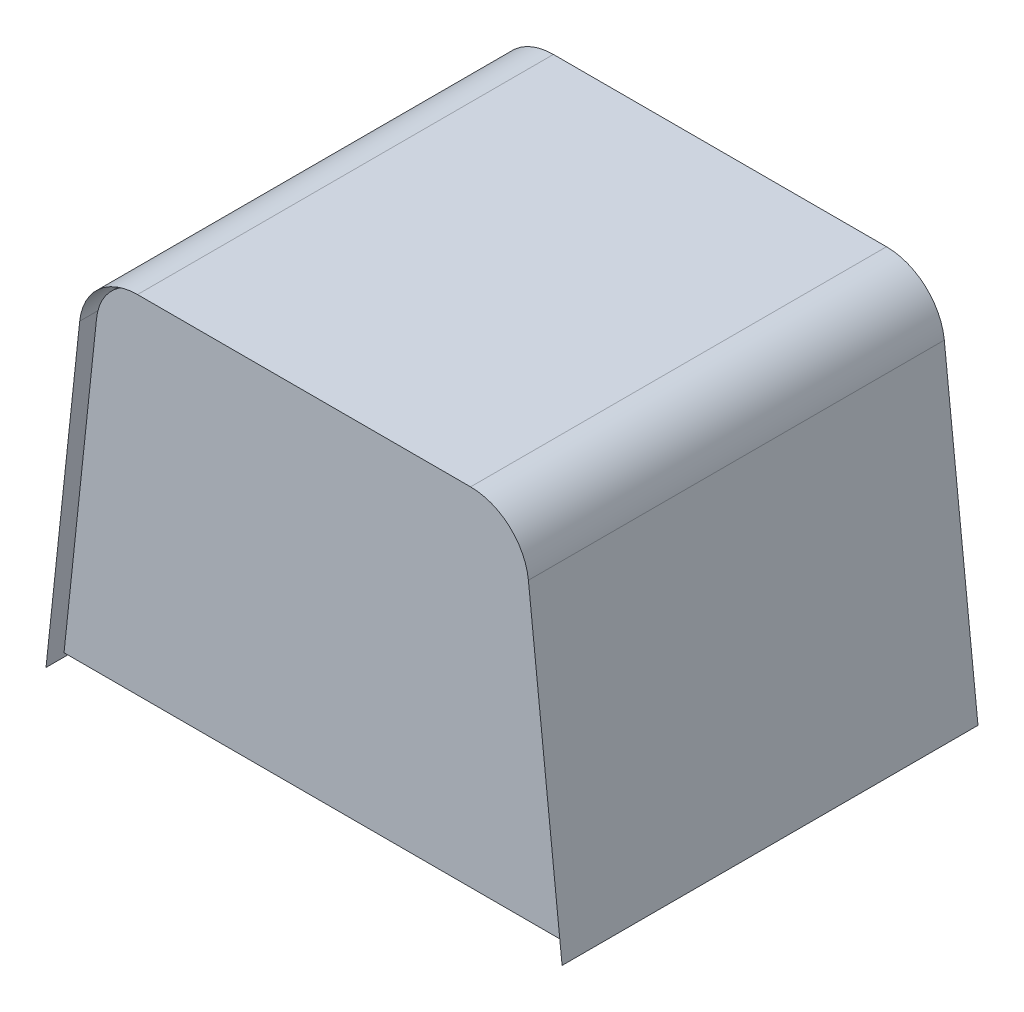
ISO-10303-21;
HEADER;
FILE_DESCRIPTION(('STEP AP214'),'2;1');
FILE_NAME('part.step','',(''),(''),'','','');
FILE_SCHEMA(('AUTOMOTIVE_DESIGN { 1 0 10303 214 1 1 1 1 }'));
ENDSEC;
DATA;
#1=APPLICATION_CONTEXT('core data for automotive mechanical design processes');
#2=APPLICATION_PROTOCOL_DEFINITION('international standard','automotive_design',2000,#1);
#3=PRODUCT_CONTEXT('',#1,'mechanical');
#4=PRODUCT('Part','Part','',(#3));
#5=PRODUCT_RELATED_PRODUCT_CATEGORY('part','',(#4));
#6=PRODUCT_DEFINITION_FORMATION('','',#4);
#7=PRODUCT_DEFINITION_CONTEXT('part definition',#1,'design');
#8=PRODUCT_DEFINITION('design','',#6,#7);
#9=PRODUCT_DEFINITION_SHAPE('','',#8);
#10=(LENGTH_UNIT() NAMED_UNIT(*) SI_UNIT(.MILLI.,.METRE.));
#11=(NAMED_UNIT(*) PLANE_ANGLE_UNIT() SI_UNIT($,.RADIAN.));
#12=(NAMED_UNIT(*) SI_UNIT($,.STERADIAN.) SOLID_ANGLE_UNIT());
#13=UNCERTAINTY_MEASURE_WITH_UNIT(LENGTH_MEASURE(1.E-05),#10,'distance_accuracy_value','');
#14=(GEOMETRIC_REPRESENTATION_CONTEXT(3) GLOBAL_UNCERTAINTY_ASSIGNED_CONTEXT((#13)) GLOBAL_UNIT_ASSIGNED_CONTEXT((#10,
#11,#12)) REPRESENTATION_CONTEXT('',''));
#15=CARTESIAN_POINT('',(0.,0.,0.));
#16=DIRECTION('',(0.,0.,1.));
#17=DIRECTION('',(1.,0.,0.));
#18=AXIS2_PLACEMENT_3D('',#15,#16,#17);
#19=CARTESIAN_POINT('',(351.790370079194,470.793395409451,-262.25));
#20=DIRECTION('',(0.994388913179112,0.105786054593523,0.));
#21=DIRECTION('',(-0.105786054593523,0.994388913179112,0.));
#22=AXIS2_PLACEMENT_3D('',#19,#20,#21);
#23=PLANE('',#22);
#24=DIRECTION('',(-0.105786054593523,0.994388913179112,0.));
#25=VECTOR('',#24,1.);
#26=CARTESIAN_POINT('',(351.790370079194,470.793395409451,-277.25));
#27=LINE('',#26,#25);
#28=CARTESIAN_POINT('',(403.377160898097,-14.1224382882355,-277.25));
#29=VERTEX_POINT('',#28);
#30=CARTESIAN_POINT('',(358.449410098178,408.198419230998,-277.25));
#31=VERTEX_POINT('',#30);
#32=EDGE_CURVE('E13',#29,#31,#27,.T.);
#33=ORIENTED_EDGE('',*,*,#32,.T.);
#34=DIRECTION('',(0.,0.,1.));
#35=VECTOR('',#34,1.);
#36=CARTESIAN_POINT('',(358.449410098178,408.198419230998,-262.25));
#37=LINE('',#36,#35);
#38=CARTESIAN_POINT('',(358.449410098178,408.198419230998,277.25));
#39=VERTEX_POINT('',#38);
#40=EDGE_CURVE('E97',#31,#39,#37,.T.);
#41=ORIENTED_EDGE('',*,*,#40,.T.);
#42=DIRECTION('',(-0.105786054593523,0.994388913179112,0.));
#43=VECTOR('',#42,1.);
#44=CARTESIAN_POINT('',(351.790370079194,470.793395409451,277.25));
#45=LINE('',#44,#43);
#46=CARTESIAN_POINT('',(403.377160898097,-14.1224382882355,277.25));
#47=VERTEX_POINT('',#46);
#48=EDGE_CURVE('E148',#39,#47,#45,.F.);
#49=ORIENTED_EDGE('',*,*,#48,.T.);
#50=DIRECTION('',(0.,0.,1.));
#51=VECTOR('',#50,1.);
#52=CARTESIAN_POINT('',(403.377160898097,-14.1224382882355,-262.25));
#53=LINE('',#52,#51);
#54=EDGE_CURVE('E88',#47,#29,#53,.F.);
#55=ORIENTED_EDGE('',*,*,#54,.T.);
#56=EDGE_LOOP('',(#33,#41,#49,#55));
#57=FACE_BOUND('',#56,.T.);
#58=ADVANCED_FACE('F79',(#57),#23,.T.);
#59=CARTESIAN_POINT('',(281.384269326797,400.,0.));
#60=DIRECTION('',(0.,0.,-1.));
#61=DIRECTION('',(-1.,0.,0.));
#62=AXIS2_PLACEMENT_3D('',#59,#60,#61);
#63=CYLINDRICAL_SURFACE('',#62,77.5);
#64=ORIENTED_EDGE('',*,*,#40,.F.);
#65=CARTESIAN_POINT('',(281.384269326797,400.,-277.25));
#66=DIRECTION('',(0.,0.,-1.));
#67=DIRECTION('',(-1.,0.,0.));
#68=AXIS2_PLACEMENT_3D('',#65,#66,#67);
#69=CIRCLE('',#68,77.5);
#70=CARTESIAN_POINT('',(281.384269326797,477.5,-277.25));
#71=VERTEX_POINT('',#70);
#72=EDGE_CURVE('E149',#31,#71,#69,.F.);
#73=ORIENTED_EDGE('',*,*,#72,.T.);
#74=DIRECTION('',(0.,0.,1.));
#75=VECTOR('',#74,1.);
#76=CARTESIAN_POINT('',(281.384269326797,477.5,0.));
#77=LINE('',#76,#75);
#78=CARTESIAN_POINT('',(281.384269326797,477.5,277.25));
#79=VERTEX_POINT('',#78);
#80=EDGE_CURVE('E150',#71,#79,#77,.T.);
#81=ORIENTED_EDGE('',*,*,#80,.T.);
#82=CARTESIAN_POINT('',(281.384269326797,400.,277.25));
#83=DIRECTION('',(0.,0.,-1.));
#84=DIRECTION('',(-1.,0.,0.));
#85=AXIS2_PLACEMENT_3D('',#82,#83,#84);
#86=CIRCLE('',#85,77.5);
#87=EDGE_CURVE('E152',#79,#39,#86,.T.);
#88=ORIENTED_EDGE('',*,*,#87,.T.);
#89=EDGE_LOOP('',(#64,#73,#81,#88));
#90=FACE_BOUND('',#89,.T.);
#91=ADVANCED_FACE('F195',(#90),#63,.T.);
#92=CARTESIAN_POINT('',(0.,477.5,0.));
#93=DIRECTION('',(0.,1.,0.));
#94=DIRECTION('',(0.,0.,1.));
#95=AXIS2_PLACEMENT_3D('',#92,#93,#94);
#96=PLANE('',#95);
#97=ORIENTED_EDGE('',*,*,#80,.F.);
#98=DIRECTION('',(1.,0.,0.));
#99=VECTOR('',#98,1.);
#100=CARTESIAN_POINT('',(0.,477.5,-277.25));
#101=LINE('',#100,#99);
#102=CARTESIAN_POINT('',(-162.701816096447,477.5,-277.25));
#103=VERTEX_POINT('',#102);
#104=EDGE_CURVE('E153',#71,#103,#101,.F.);
#105=ORIENTED_EDGE('',*,*,#104,.T.);
#106=DIRECTION('',(0.,0.,1.));
#107=VECTOR('',#106,1.);
#108=CARTESIAN_POINT('',(-162.701816096447,477.5,0.));
#109=LINE('',#108,#107);
#110=CARTESIAN_POINT('',(-162.701816096447,477.5,277.25));
#111=VERTEX_POINT('',#110);
#112=EDGE_CURVE('E154',#103,#111,#109,.T.);
#113=ORIENTED_EDGE('',*,*,#112,.T.);
#114=DIRECTION('',(1.,0.,0.));
#115=VECTOR('',#114,1.);
#116=CARTESIAN_POINT('',(0.,477.5,277.25));
#117=LINE('',#116,#115);
#118=EDGE_CURVE('E156',#111,#79,#117,.T.);
#119=ORIENTED_EDGE('',*,*,#118,.T.);
#120=EDGE_LOOP('',(#97,#105,#113,#119));
#121=FACE_BOUND('',#120,.T.);
#122=ADVANCED_FACE('F176',(#121),#96,.T.);
#123=CARTESIAN_POINT('',(-162.701816096447,400.,0.));
#124=DIRECTION('',(0.,0.,1.));
#125=DIRECTION('',(1.,0.,0.));
#126=AXIS2_PLACEMENT_3D('',#123,#124,#125);
#127=CYLINDRICAL_SURFACE('',#126,77.5);
#128=ORIENTED_EDGE('',*,*,#112,.F.);
#129=CARTESIAN_POINT('',(-162.701816096447,400.,-277.25));
#130=DIRECTION('',(0.,0.,1.));
#131=DIRECTION('',(1.,0.,0.));
#132=AXIS2_PLACEMENT_3D('',#129,#130,#131);
#133=CIRCLE('',#132,77.5);
#134=CARTESIAN_POINT('',(-239.766956867828,408.198419230998,-277.25));
#135=VERTEX_POINT('',#134);
#136=EDGE_CURVE('E143',#103,#135,#133,.T.);
#137=ORIENTED_EDGE('',*,*,#136,.T.);
#138=DIRECTION('',(0.,0.,1.));
#139=VECTOR('',#138,1.);
#140=CARTESIAN_POINT('',(-239.766956867828,408.198419230998,0.));
#141=LINE('',#140,#139);
#142=CARTESIAN_POINT('',(-239.766956867828,408.198419230998,277.25));
#143=VERTEX_POINT('',#142);
#144=EDGE_CURVE('E82',#135,#143,#141,.T.);
#145=ORIENTED_EDGE('',*,*,#144,.T.);
#146=CARTESIAN_POINT('',(-162.701816096447,400.,277.25));
#147=DIRECTION('',(0.,0.,1.));
#148=DIRECTION('',(1.,0.,0.));
#149=AXIS2_PLACEMENT_3D('',#146,#147,#148);
#150=CIRCLE('',#149,77.5);
#151=EDGE_CURVE('E157',#143,#111,#150,.F.);
#152=ORIENTED_EDGE('',*,*,#151,.T.);
#153=EDGE_LOOP('',(#128,#137,#145,#152));
#154=FACE_BOUND('',#153,.T.);
#155=ADVANCED_FACE('F174',(#154),#127,.T.);
#156=CARTESIAN_POINT('',(-283.107916848843,0.793395409451414,-262.25));
#157=DIRECTION('',(-0.994388913179112,0.105786054593523,0.));
#158=DIRECTION('',(-0.105786054593523,-0.994388913179112,0.));
#159=AXIS2_PLACEMENT_3D('',#156,#157,#158);
#160=PLANE('',#159);
#161=DIRECTION('',(-0.105786054593523,-0.994388913179112,0.));
#162=VECTOR('',#161,1.);
#163=CARTESIAN_POINT('',(-283.107916848843,0.793395409451414,277.25));
#164=LINE('',#163,#162);
#165=CARTESIAN_POINT('',(-284.694707667746,-14.1224382882353,277.25));
#166=VERTEX_POINT('',#165);
#167=EDGE_CURVE('E138',#166,#143,#164,.F.);
#168=ORIENTED_EDGE('',*,*,#167,.T.);
#169=ORIENTED_EDGE('',*,*,#144,.F.);
#170=DIRECTION('',(-0.105786054593523,-0.994388913179112,0.));
#171=VECTOR('',#170,1.);
#172=CARTESIAN_POINT('',(-283.107916848843,0.793395409451414,-277.25));
#173=LINE('',#172,#171);
#174=CARTESIAN_POINT('',(-284.694707667746,-14.1224382882353,-277.25));
#175=VERTEX_POINT('',#174);
#176=EDGE_CURVE('E132',#135,#175,#173,.T.);
#177=ORIENTED_EDGE('',*,*,#176,.T.);
#178=DIRECTION('',(0.,0.,1.));
#179=VECTOR('',#178,1.);
#180=CARTESIAN_POINT('',(-284.694707667746,-14.1224382882353,-262.25));
#181=LINE('',#180,#179);
#182=EDGE_CURVE('E129',#175,#166,#181,.T.);
#183=ORIENTED_EDGE('',*,*,#182,.T.);
#184=EDGE_LOOP('',(#168,#169,#177,#183));
#185=FACE_BOUND('',#184,.T.);
#186=ADVANCED_FACE('F80',(#185),#160,.T.);
#187=OPEN_SHELL('',(#58,#91,#122,#155,#186));
#188=SHELL_BASED_SURFACE_MODEL('B2',(#187));
#189=CARTESIAN_POINT('',(225.65,370.,262.25));
#190=DIRECTION('',(0.,0.,-1.));
#191=DIRECTION('',(-1.,0.,0.));
#192=AXIS2_PLACEMENT_3D('',#189,#190,#191);
#193=PLANE('',#192);
#194=DIRECTION('',(-0.105786054593523,0.994388913179112,0.));
#195=VECTOR('',#194,1.);
#196=CARTESIAN_POINT('',(344.332453230351,470.,262.25));
#197=LINE('',#196,#195);
#198=CARTESIAN_POINT('',(394.332453230351,0.,262.25));
#199=VERTEX_POINT('',#198);
#200=CARTESIAN_POINT('',(350.991493249335,407.405023821547,262.25));
#201=VERTEX_POINT('',#200);
#202=EDGE_CURVE('E326',#199,#201,#197,.T.);
#203=ORIENTED_EDGE('',*,*,#202,.T.);
#204=CARTESIAN_POINT('',(281.384269326797,400.,262.25));
#205=DIRECTION('',(0.,0.,-1.));
#206=DIRECTION('',(-1.,0.,0.));
#207=AXIS2_PLACEMENT_3D('',#204,#205,#206);
#208=CIRCLE('',#207,70.);
#209=CARTESIAN_POINT('',(281.384269326797,470.,262.25));
#210=VERTEX_POINT('',#209);
#211=EDGE_CURVE('E264',#201,#210,#208,.F.);
#212=ORIENTED_EDGE('',*,*,#211,.T.);
#213=DIRECTION('',(1.,0.,0.));
#214=VECTOR('',#213,1.);
#215=CARTESIAN_POINT('',(-225.65,470.,262.25));
#216=LINE('',#215,#214);
#217=CARTESIAN_POINT('',(-162.701816096447,470.,262.25));
#218=VERTEX_POINT('',#217);
#219=EDGE_CURVE('E342',#218,#210,#216,.T.);
#220=ORIENTED_EDGE('',*,*,#219,.F.);
#221=CARTESIAN_POINT('',(-162.701816096447,400.,262.25));
#222=DIRECTION('',(0.,0.,-1.));
#223=DIRECTION('',(-1.,0.,0.));
#224=AXIS2_PLACEMENT_3D('',#221,#222,#223);
#225=CIRCLE('',#224,70.);
#226=CARTESIAN_POINT('',(-232.309040018984,407.405023821547,262.25));
#227=VERTEX_POINT('',#226);
#228=EDGE_CURVE('E271',#218,#227,#225,.F.);
#229=ORIENTED_EDGE('',*,*,#228,.T.);
#230=DIRECTION('',(-0.105786054593523,-0.994388913179112,0.));
#231=VECTOR('',#230,1.);
#232=CARTESIAN_POINT('',(-275.65,0.,262.25));
#233=LINE('',#232,#231);
#234=CARTESIAN_POINT('',(-275.65,0.,262.25));
#235=VERTEX_POINT('',#234);
#236=EDGE_CURVE('E332',#227,#235,#233,.T.);
#237=ORIENTED_EDGE('',*,*,#236,.T.);
#238=DIRECTION('',(1.,0.,0.));
#239=VECTOR('',#238,1.);
#240=CARTESIAN_POINT('',(225.65,0.,262.25));
#241=LINE('',#240,#239);
#242=EDGE_CURVE('E322',#235,#199,#241,.T.);
#243=ORIENTED_EDGE('',*,*,#242,.T.);
#244=EDGE_LOOP('',(#203,#212,#220,#229,#237,#243));
#245=FACE_BOUND('',#244,.T.);
#246=ADVANCED_FACE('F256',(#245),#193,.F.);
#247=CARTESIAN_POINT('',(-225.65,370.,-262.25));
#248=DIRECTION('',(0.,0.,-1.));
#249=DIRECTION('',(-1.,0.,0.));
#250=AXIS2_PLACEMENT_3D('',#247,#248,#249);
#251=PLANE('',#250);
#252=DIRECTION('',(-1.,0.,0.));
#253=VECTOR('',#252,1.);
#254=CARTESIAN_POINT('',(344.332453230351,470.,-262.25));
#255=LINE('',#254,#253);
#256=CARTESIAN_POINT('',(281.384269326797,470.,-262.25));
#257=VERTEX_POINT('',#256);
#258=CARTESIAN_POINT('',(-162.701816096447,470.,-262.25));
#259=VERTEX_POINT('',#258);
#260=EDGE_CURVE('E338',#257,#259,#255,.T.);
#261=ORIENTED_EDGE('',*,*,#260,.F.);
#262=CARTESIAN_POINT('',(281.384269326797,400.,-262.25));
#263=DIRECTION('',(0.,0.,-1.));
#264=DIRECTION('',(-1.,0.,0.));
#265=AXIS2_PLACEMENT_3D('',#262,#263,#264);
#266=CIRCLE('',#265,70.);
#267=CARTESIAN_POINT('',(350.991493249335,407.405023821547,-262.25));
#268=VERTEX_POINT('',#267);
#269=EDGE_CURVE('E331',#257,#268,#266,.T.);
#270=ORIENTED_EDGE('',*,*,#269,.T.);
#271=DIRECTION('',(-0.105786054593523,0.994388913179112,0.));
#272=VECTOR('',#271,1.);
#273=CARTESIAN_POINT('',(344.332453230351,470.,-262.25));
#274=LINE('',#273,#272);
#275=CARTESIAN_POINT('',(394.332453230351,0.,-262.25));
#276=VERTEX_POINT('',#275);
#277=EDGE_CURVE('E325',#276,#268,#274,.T.);
#278=ORIENTED_EDGE('',*,*,#277,.F.);
#279=DIRECTION('',(1.,0.,0.));
#280=VECTOR('',#279,1.);
#281=CARTESIAN_POINT('',(-225.65,0.,-262.25));
#282=LINE('',#281,#280);
#283=CARTESIAN_POINT('',(-275.65,0.,-262.25));
#284=VERTEX_POINT('',#283);
#285=EDGE_CURVE('E311',#284,#276,#282,.T.);
#286=ORIENTED_EDGE('',*,*,#285,.F.);
#287=DIRECTION('',(-0.105786054593523,-0.994388913179112,0.));
#288=VECTOR('',#287,1.);
#289=CARTESIAN_POINT('',(-275.65,0.,-262.25));
#290=LINE('',#289,#288);
#291=CARTESIAN_POINT('',(-232.309040018984,407.405023821547,-262.25));
#292=VERTEX_POINT('',#291);
#293=EDGE_CURVE('E327',#292,#284,#290,.T.);
#294=ORIENTED_EDGE('',*,*,#293,.F.);
#295=CARTESIAN_POINT('',(-162.701816096447,400.,-262.25));
#296=DIRECTION('',(0.,0.,-1.));
#297=DIRECTION('',(-1.,0.,0.));
#298=AXIS2_PLACEMENT_3D('',#295,#296,#297);
#299=CIRCLE('',#298,70.);
#300=EDGE_CURVE('E351',#292,#259,#299,.T.);
#301=ORIENTED_EDGE('',*,*,#300,.T.);
#302=EDGE_LOOP('',(#261,#270,#278,#286,#294,#301));
#303=FACE_BOUND('',#302,.T.);
#304=ADVANCED_FACE('F330',(#303),#251,.T.);
#305=CARTESIAN_POINT('',(0.,0.,0.));
#306=DIRECTION('',(0.,1.,0.));
#307=DIRECTION('',(0.,0.,1.));
#308=AXIS2_PLACEMENT_3D('',#305,#306,#307);
#309=PLANE('',#308);
#310=ORIENTED_EDGE('',*,*,#242,.F.);
#311=DIRECTION('',(0.,0.,1.));
#312=VECTOR('',#311,1.);
#313=CARTESIAN_POINT('',(-275.65,0.,-262.25));
#314=LINE('',#313,#312);
#315=EDGE_CURVE('E317',#284,#235,#314,.T.);
#316=ORIENTED_EDGE('',*,*,#315,.F.);
#317=ORIENTED_EDGE('',*,*,#285,.T.);
#318=DIRECTION('',(0.,0.,1.));
#319=VECTOR('',#318,1.);
#320=CARTESIAN_POINT('',(394.332453230351,0.,-262.25));
#321=LINE('',#320,#319);
#322=EDGE_CURVE('E315',#276,#199,#321,.T.);
#323=ORIENTED_EDGE('',*,*,#322,.T.);
#324=EDGE_LOOP('',(#310,#316,#317,#323));
#325=FACE_BOUND('',#324,.T.);
#326=ADVANCED_FACE('F314',(#325),#309,.F.);
#327=CARTESIAN_POINT('',(0.,470.,0.));
#328=DIRECTION('',(0.,1.,0.));
#329=DIRECTION('',(0.,0.,1.));
#330=AXIS2_PLACEMENT_3D('',#327,#328,#329);
#331=PLANE('',#330);
#332=ORIENTED_EDGE('',*,*,#219,.T.);
#333=DIRECTION('',(0.,0.,-1.));
#334=VECTOR('',#333,1.);
#335=CARTESIAN_POINT('',(281.384269326797,470.,0.));
#336=LINE('',#335,#334);
#337=EDGE_CURVE('E348',#210,#257,#336,.T.);
#338=ORIENTED_EDGE('',*,*,#337,.T.);
#339=ORIENTED_EDGE('',*,*,#260,.T.);
#340=DIRECTION('',(0.,0.,1.));
#341=VECTOR('',#340,1.);
#342=CARTESIAN_POINT('',(-162.701816096447,470.,0.));
#343=LINE('',#342,#341);
#344=EDGE_CURVE('E321',#259,#218,#343,.T.);
#345=ORIENTED_EDGE('',*,*,#344,.T.);
#346=EDGE_LOOP('',(#332,#338,#339,#345));
#347=FACE_BOUND('',#346,.T.);
#348=ADVANCED_FACE('F359',(#347),#331,.T.);
#349=CARTESIAN_POINT('',(344.332453230351,470.,-262.25));
#350=DIRECTION('',(0.994388913179112,0.105786054593523,0.));
#351=DIRECTION('',(-0.105786054593523,0.994388913179112,0.));
#352=AXIS2_PLACEMENT_3D('',#349,#350,#351);
#353=PLANE('',#352);
#354=ORIENTED_EDGE('',*,*,#277,.T.);
#355=DIRECTION('',(0.,0.,-1.));
#356=VECTOR('',#355,1.);
#357=CARTESIAN_POINT('',(350.991493249335,407.405023821547,-262.25));
#358=LINE('',#357,#356);
#359=EDGE_CURVE('E279',#268,#201,#358,.F.);
#360=ORIENTED_EDGE('',*,*,#359,.T.);
#361=ORIENTED_EDGE('',*,*,#202,.F.);
#362=ORIENTED_EDGE('',*,*,#322,.F.);
#363=EDGE_LOOP('',(#354,#360,#361,#362));
#364=FACE_BOUND('',#363,.T.);
#365=ADVANCED_FACE('F324',(#364),#353,.T.);
#366=CARTESIAN_POINT('',(-275.65,0.,-262.25));
#367=DIRECTION('',(-0.994388913179112,0.105786054593523,0.));
#368=DIRECTION('',(-0.105786054593523,-0.994388913179112,0.));
#369=AXIS2_PLACEMENT_3D('',#366,#367,#368);
#370=PLANE('',#369);
#371=ORIENTED_EDGE('',*,*,#236,.F.);
#372=DIRECTION('',(0.,0.,1.));
#373=VECTOR('',#372,1.);
#374=CARTESIAN_POINT('',(-232.309040018984,407.405023821547,-262.25));
#375=LINE('',#374,#373);
#376=EDGE_CURVE('E77',#227,#292,#375,.F.);
#377=ORIENTED_EDGE('',*,*,#376,.T.);
#378=ORIENTED_EDGE('',*,*,#293,.T.);
#379=ORIENTED_EDGE('',*,*,#315,.T.);
#380=EDGE_LOOP('',(#371,#377,#378,#379));
#381=FACE_BOUND('',#380,.T.);
#382=ADVANCED_FACE('F363',(#381),#370,.T.);
#383=CARTESIAN_POINT('',(281.384269326797,400.,0.));
#384=DIRECTION('',(0.,0.,-1.));
#385=DIRECTION('',(-1.,0.,0.));
#386=AXIS2_PLACEMENT_3D('',#383,#384,#385);
#387=CYLINDRICAL_SURFACE('',#386,70.);
#388=ORIENTED_EDGE('',*,*,#211,.F.);
#389=ORIENTED_EDGE('',*,*,#359,.F.);
#390=ORIENTED_EDGE('',*,*,#269,.F.);
#391=ORIENTED_EDGE('',*,*,#337,.F.);
#392=EDGE_LOOP('',(#388,#389,#390,#391));
#393=FACE_BOUND('',#392,.T.);
#394=ADVANCED_FACE('F361',(#393),#387,.T.);
#395=CARTESIAN_POINT('',(-162.701816096447,400.,0.));
#396=DIRECTION('',(0.,0.,1.));
#397=DIRECTION('',(1.,0.,0.));
#398=AXIS2_PLACEMENT_3D('',#395,#396,#397);
#399=CYLINDRICAL_SURFACE('',#398,70.);
#400=ORIENTED_EDGE('',*,*,#300,.F.);
#401=ORIENTED_EDGE('',*,*,#376,.F.);
#402=ORIENTED_EDGE('',*,*,#228,.F.);
#403=ORIENTED_EDGE('',*,*,#344,.F.);
#404=EDGE_LOOP('',(#400,#401,#402,#403));
#405=FACE_BOUND('',#404,.T.);
#406=ADVANCED_FACE('F258',(#405),#399,.T.);
#407=CLOSED_SHELL('',(#246,#304,#326,#348,#365,#382,#394,#406));
#408=MANIFOLD_SOLID_BREP('B7',#407);
#409=ADVANCED_BREP_SHAPE_REPRESENTATION('',(#18,#408),#14);
#410=MANIFOLD_SURFACE_SHAPE_REPRESENTATION('',(#18,#188),#14);
#411=SHAPE_REPRESENTATION('',(#18),#14);
#412=SHAPE_DEFINITION_REPRESENTATION(#9,#411);
#413=SHAPE_REPRESENTATION_RELATIONSHIP('','',#411,#409);
#414=SHAPE_REPRESENTATION_RELATIONSHIP('','',#411,#410);
ENDSEC;
END-ISO-10303-21;
